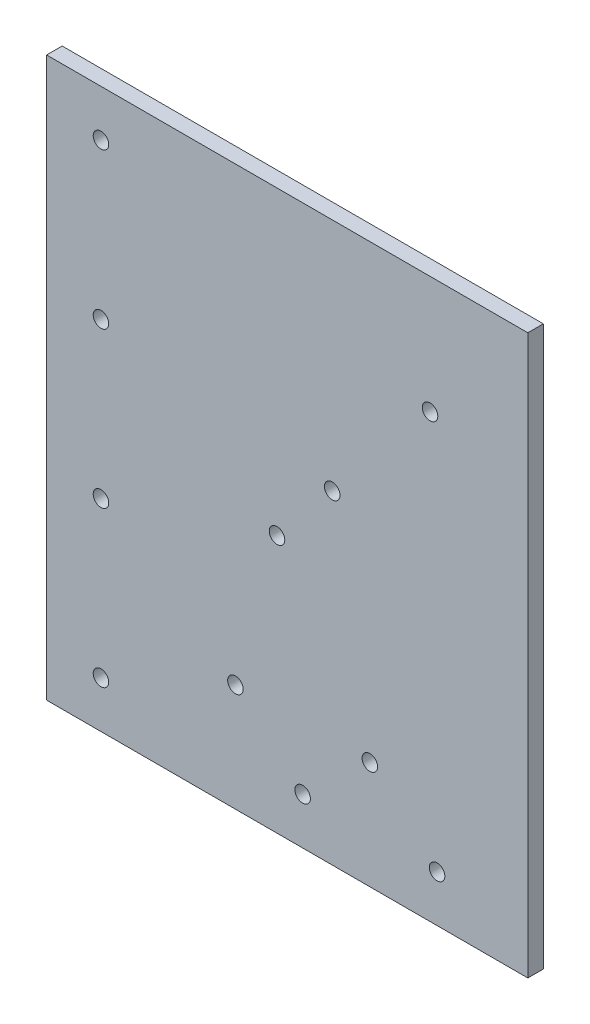
ISO-10303-21;
HEADER;
FILE_DESCRIPTION(('STEP AP214'),'2;1');
FILE_NAME('part.step','',(''),(''),'','','');
FILE_SCHEMA(('AUTOMOTIVE_DESIGN { 1 0 10303 214 1 1 1 1 }'));
ENDSEC;
DATA;
#1=APPLICATION_CONTEXT('core data for automotive mechanical design processes');
#2=APPLICATION_PROTOCOL_DEFINITION('international standard','automotive_design',2000,#1);
#3=PRODUCT_CONTEXT('',#1,'mechanical');
#4=PRODUCT('Part','Part','',(#3));
#5=PRODUCT_RELATED_PRODUCT_CATEGORY('part','',(#4));
#6=PRODUCT_DEFINITION_FORMATION('','',#4);
#7=PRODUCT_DEFINITION_CONTEXT('part definition',#1,'design');
#8=PRODUCT_DEFINITION('design','',#6,#7);
#9=PRODUCT_DEFINITION_SHAPE('','',#8);
#10=(LENGTH_UNIT() NAMED_UNIT(*) SI_UNIT(.MILLI.,.METRE.));
#11=(NAMED_UNIT(*) PLANE_ANGLE_UNIT() SI_UNIT($,.RADIAN.));
#12=(NAMED_UNIT(*) SI_UNIT($,.STERADIAN.) SOLID_ANGLE_UNIT());
#13=UNCERTAINTY_MEASURE_WITH_UNIT(LENGTH_MEASURE(1.E-05),#10,'distance_accuracy_value','');
#14=(GEOMETRIC_REPRESENTATION_CONTEXT(3) GLOBAL_UNCERTAINTY_ASSIGNED_CONTEXT((#13)) GLOBAL_UNIT_ASSIGNED_CONTEXT((#10,
#11,#12)) REPRESENTATION_CONTEXT('',''));
#15=CARTESIAN_POINT('',(0.,0.,0.));
#16=DIRECTION('',(0.,0.,1.));
#17=DIRECTION('',(1.,0.,0.));
#18=AXIS2_PLACEMENT_3D('',#15,#16,#17);
#19=CARTESIAN_POINT('',(0.,0.,12.7));
#20=DIRECTION('',(1.,0.,0.));
#21=DIRECTION('',(0.,0.,-1.));
#22=AXIS2_PLACEMENT_3D('',#19,#20,#21);
#23=PLANE('',#22);
#24=DIRECTION('',(0.,-1.,0.));
#25=VECTOR('',#24,1.);
#26=CARTESIAN_POINT('',(0.,0.,0.));
#27=LINE('',#26,#25);
#28=CARTESIAN_POINT('',(0.,457.2,0.));
#29=VERTEX_POINT('',#28);
#30=CARTESIAN_POINT('',(0.,0.,0.));
#31=VERTEX_POINT('',#30);
#32=EDGE_CURVE('E104',#29,#31,#27,.T.);
#33=ORIENTED_EDGE('',*,*,#32,.T.);
#34=DIRECTION('',(0.,0.,-1.));
#35=VECTOR('',#34,1.);
#36=CARTESIAN_POINT('',(0.,0.,12.7));
#37=LINE('',#36,#35);
#38=CARTESIAN_POINT('',(0.,0.,12.7));
#39=VERTEX_POINT('',#38);
#40=EDGE_CURVE('E95',#39,#31,#37,.T.);
#41=ORIENTED_EDGE('',*,*,#40,.F.);
#42=DIRECTION('',(0.,-1.,0.));
#43=VECTOR('',#42,1.);
#44=CARTESIAN_POINT('',(0.,0.,12.7));
#45=LINE('',#44,#43);
#46=CARTESIAN_POINT('',(0.,457.2,12.7));
#47=VERTEX_POINT('',#46);
#48=EDGE_CURVE('E89',#47,#39,#45,.T.);
#49=ORIENTED_EDGE('',*,*,#48,.F.);
#50=DIRECTION('',(0.,0.,-1.));
#51=VECTOR('',#50,1.);
#52=CARTESIAN_POINT('',(0.,457.2,12.7));
#53=LINE('',#52,#51);
#54=EDGE_CURVE('E100',#47,#29,#53,.T.);
#55=ORIENTED_EDGE('',*,*,#54,.T.);
#56=EDGE_LOOP('',(#33,#41,#49,#55));
#57=FACE_BOUND('',#56,.T.);
#58=ADVANCED_FACE('F34',(#57),#23,.F.);
#59=CARTESIAN_POINT('',(0.,0.,12.7));
#60=DIRECTION('',(0.,1.,0.));
#61=DIRECTION('',(0.,0.,1.));
#62=AXIS2_PLACEMENT_3D('',#59,#60,#61);
#63=PLANE('',#62);
#64=DIRECTION('',(1.,0.,0.));
#65=VECTOR('',#64,1.);
#66=CARTESIAN_POINT('',(0.,0.,0.));
#67=LINE('',#66,#65);
#68=CARTESIAN_POINT('',(393.7,0.,0.));
#69=VERTEX_POINT('',#68);
#70=EDGE_CURVE('E94',#31,#69,#67,.T.);
#71=ORIENTED_EDGE('',*,*,#70,.T.);
#72=DIRECTION('',(0.,0.,-1.));
#73=VECTOR('',#72,1.);
#74=CARTESIAN_POINT('',(393.7,0.,12.7));
#75=LINE('',#74,#73);
#76=CARTESIAN_POINT('',(393.7,0.,12.7));
#77=VERTEX_POINT('',#76);
#78=EDGE_CURVE('E92',#77,#69,#75,.T.);
#79=ORIENTED_EDGE('',*,*,#78,.F.);
#80=DIRECTION('',(1.,0.,0.));
#81=VECTOR('',#80,1.);
#82=CARTESIAN_POINT('',(0.,0.,12.7));
#83=LINE('',#82,#81);
#84=EDGE_CURVE('E83',#39,#77,#83,.T.);
#85=ORIENTED_EDGE('',*,*,#84,.F.);
#86=ORIENTED_EDGE('',*,*,#40,.T.);
#87=EDGE_LOOP('',(#71,#79,#85,#86));
#88=FACE_BOUND('',#87,.T.);
#89=ADVANCED_FACE('F93',(#88),#63,.F.);
#90=CARTESIAN_POINT('',(393.7,0.,12.7));
#91=DIRECTION('',(-1.,0.,0.));
#92=DIRECTION('',(0.,0.,1.));
#93=AXIS2_PLACEMENT_3D('',#90,#91,#92);
#94=PLANE('',#93);
#95=DIRECTION('',(0.,1.,0.));
#96=VECTOR('',#95,1.);
#97=CARTESIAN_POINT('',(393.7,0.,0.));
#98=LINE('',#97,#96);
#99=CARTESIAN_POINT('',(393.7,457.2,0.));
#100=VERTEX_POINT('',#99);
#101=EDGE_CURVE('E69',#69,#100,#98,.T.);
#102=ORIENTED_EDGE('',*,*,#101,.T.);
#103=DIRECTION('',(0.,0.,-1.));
#104=VECTOR('',#103,1.);
#105=CARTESIAN_POINT('',(393.7,457.2,12.7));
#106=LINE('',#105,#104);
#107=CARTESIAN_POINT('',(393.7,457.2,12.7));
#108=VERTEX_POINT('',#107);
#109=EDGE_CURVE('E96',#108,#100,#106,.T.);
#110=ORIENTED_EDGE('',*,*,#109,.F.);
#111=DIRECTION('',(0.,1.,0.));
#112=VECTOR('',#111,1.);
#113=CARTESIAN_POINT('',(393.7,0.,12.7));
#114=LINE('',#113,#112);
#115=EDGE_CURVE('E87',#77,#108,#114,.T.);
#116=ORIENTED_EDGE('',*,*,#115,.F.);
#117=ORIENTED_EDGE('',*,*,#78,.T.);
#118=EDGE_LOOP('',(#102,#110,#116,#117));
#119=FACE_BOUND('',#118,.T.);
#120=ADVANCED_FACE('F98',(#119),#94,.F.);
#121=CARTESIAN_POINT('',(0.,457.2,12.7));
#122=DIRECTION('',(0.,-1.,0.));
#123=DIRECTION('',(0.,0.,-1.));
#124=AXIS2_PLACEMENT_3D('',#121,#122,#123);
#125=PLANE('',#124);
#126=DIRECTION('',(-1.,0.,0.));
#127=VECTOR('',#126,1.);
#128=CARTESIAN_POINT('',(0.,457.2,0.));
#129=LINE('',#128,#127);
#130=EDGE_CURVE('E75',#100,#29,#129,.T.);
#131=ORIENTED_EDGE('',*,*,#130,.T.);
#132=ORIENTED_EDGE('',*,*,#54,.F.);
#133=DIRECTION('',(-1.,0.,0.));
#134=VECTOR('',#133,1.);
#135=CARTESIAN_POINT('',(0.,457.2,12.7));
#136=LINE('',#135,#134);
#137=EDGE_CURVE('E52',#108,#47,#136,.T.);
#138=ORIENTED_EDGE('',*,*,#137,.F.);
#139=ORIENTED_EDGE('',*,*,#109,.T.);
#140=EDGE_LOOP('',(#131,#132,#138,#139));
#141=FACE_BOUND('',#140,.T.);
#142=ADVANCED_FACE('F140',(#141),#125,.F.);
#143=CARTESIAN_POINT('',(0.,457.2,12.7));
#144=DIRECTION('',(0.,0.,-1.));
#145=DIRECTION('',(-1.,0.,0.));
#146=AXIS2_PLACEMENT_3D('',#143,#144,#145);
#147=PLANE('',#146);
#148=CARTESIAN_POINT('',(264.45,88.1,12.7));
#149=DIRECTION('',(0.,0.,1.));
#150=DIRECTION('',(1.,0.,0.));
#151=AXIS2_PLACEMENT_3D('',#148,#149,#150);
#152=CIRCLE('',#151,6.35000000000002);
#153=CARTESIAN_POINT('',(270.8,88.1,12.7));
#154=VERTEX_POINT('',#153);
#155=EDGE_CURVE('E208',#154,#154,#152,.T.);
#156=ORIENTED_EDGE('',*,*,#155,.F.);
#157=EDGE_LOOP('',(#156));
#158=FACE_BOUND('',#157,.T.);
#159=CARTESIAN_POINT('',(154.45,88.1,12.7));
#160=DIRECTION('',(0.,0.,1.));
#161=DIRECTION('',(1.,0.,0.));
#162=AXIS2_PLACEMENT_3D('',#159,#160,#161);
#163=CIRCLE('',#162,6.34999999999999);
#164=CARTESIAN_POINT('',(160.8,88.1,12.7));
#165=VERTEX_POINT('',#164);
#166=EDGE_CURVE('E210',#165,#165,#163,.T.);
#167=ORIENTED_EDGE('',*,*,#166,.F.);
#168=EDGE_LOOP('',(#167));
#169=FACE_BOUND('',#168,.T.);
#170=CARTESIAN_POINT('',(319.45,38.1,12.7));
#171=DIRECTION('',(0.,0.,1.));
#172=DIRECTION('',(1.,0.,0.));
#173=AXIS2_PLACEMENT_3D('',#170,#171,#172);
#174=CIRCLE('',#173,6.35000000000002);
#175=CARTESIAN_POINT('',(325.8,38.1,12.7));
#176=VERTEX_POINT('',#175);
#177=EDGE_CURVE('E218',#176,#176,#174,.T.);
#178=ORIENTED_EDGE('',*,*,#177,.F.);
#179=EDGE_LOOP('',(#178));
#180=FACE_BOUND('',#179,.T.);
#181=CARTESIAN_POINT('',(209.45,38.1,12.7));
#182=DIRECTION('',(0.,0.,1.));
#183=DIRECTION('',(1.,0.,0.));
#184=AXIS2_PLACEMENT_3D('',#181,#182,#183);
#185=CIRCLE('',#184,6.34999999999999);
#186=CARTESIAN_POINT('',(215.8,38.1,12.7));
#187=VERTEX_POINT('',#186);
#188=EDGE_CURVE('E221',#187,#187,#185,.T.);
#189=ORIENTED_EDGE('',*,*,#188,.F.);
#190=EDGE_LOOP('',(#189));
#191=FACE_BOUND('',#190,.T.);
#192=CARTESIAN_POINT('',(188.491489924508,210.94978790941,12.7));
#193=DIRECTION('',(0.,0.,1.));
#194=DIRECTION('',(1.,0.,0.));
#195=AXIS2_PLACEMENT_3D('',#192,#193,#194);
#196=CIRCLE('',#195,6.34999999999999);
#197=CARTESIAN_POINT('',(194.841489924508,210.94978790941,12.7));
#198=VERTEX_POINT('',#197);
#199=EDGE_CURVE('E227',#198,#198,#196,.T.);
#200=ORIENTED_EDGE('',*,*,#199,.F.);
#201=EDGE_LOOP('',(#200));
#202=FACE_BOUND('',#201,.T.);
#203=CARTESIAN_POINT('',(313.67695004194,361.172340050328,12.7));
#204=DIRECTION('',(0.,0.,1.));
#205=DIRECTION('',(1.,0.,0.));
#206=AXIS2_PLACEMENT_3D('',#203,#204,#205);
#207=CIRCLE('',#206,6.35000000000002);
#208=CARTESIAN_POINT('',(320.02695004194,361.172340050328,12.7));
#209=VERTEX_POINT('',#208);
#210=EDGE_CURVE('E233',#209,#209,#207,.T.);
#211=ORIENTED_EDGE('',*,*,#210,.F.);
#212=EDGE_LOOP('',(#211));
#213=FACE_BOUND('',#212,.T.);
#214=CARTESIAN_POINT('',(233.65390008388,265.144680100656,12.7));
#215=DIRECTION('',(0.,0.,1.));
#216=DIRECTION('',(1.,0.,0.));
#217=AXIS2_PLACEMENT_3D('',#214,#215,#216);
#218=CIRCLE('',#217,6.34999999999999);
#219=CARTESIAN_POINT('',(240.00390008388,265.144680100656,12.7));
#220=VERTEX_POINT('',#219);
#221=EDGE_CURVE('E239',#220,#220,#218,.T.);
#222=ORIENTED_EDGE('',*,*,#221,.F.);
#223=EDGE_LOOP('',(#222));
#224=FACE_BOUND('',#223,.T.);
#225=CARTESIAN_POINT('',(44.45,165.1,12.7));
#226=DIRECTION('',(0.,0.,1.));
#227=DIRECTION('',(1.,0.,0.));
#228=AXIS2_PLACEMENT_3D('',#225,#226,#227);
#229=CIRCLE('',#228,6.34999999999999);
#230=CARTESIAN_POINT('',(50.8,165.1,12.7));
#231=VERTEX_POINT('',#230);
#232=EDGE_CURVE('E247',#231,#231,#229,.T.);
#233=ORIENTED_EDGE('',*,*,#232,.F.);
#234=EDGE_LOOP('',(#233));
#235=FACE_BOUND('',#234,.T.);
#236=CARTESIAN_POINT('',(44.45,38.1,12.7));
#237=DIRECTION('',(0.,0.,1.));
#238=DIRECTION('',(1.,0.,0.));
#239=AXIS2_PLACEMENT_3D('',#236,#237,#238);
#240=CIRCLE('',#239,6.34999999999999);
#241=CARTESIAN_POINT('',(50.8,38.1,12.7));
#242=VERTEX_POINT('',#241);
#243=EDGE_CURVE('E117',#242,#242,#240,.T.);
#244=ORIENTED_EDGE('',*,*,#243,.F.);
#245=EDGE_LOOP('',(#244));
#246=FACE_BOUND('',#245,.T.);
#247=ORIENTED_EDGE('',*,*,#48,.T.);
#248=ORIENTED_EDGE('',*,*,#84,.T.);
#249=ORIENTED_EDGE('',*,*,#115,.T.);
#250=ORIENTED_EDGE('',*,*,#137,.T.);
#251=EDGE_LOOP('',(#247,#248,#249,#250));
#252=FACE_BOUND('',#251,.T.);
#253=CARTESIAN_POINT('',(44.45,292.1,12.7));
#254=DIRECTION('',(0.,0.,1.));
#255=DIRECTION('',(1.,0.,0.));
#256=AXIS2_PLACEMENT_3D('',#253,#254,#255);
#257=CIRCLE('',#256,6.34999999999999);
#258=CARTESIAN_POINT('',(50.8,292.1,12.7));
#259=VERTEX_POINT('',#258);
#260=EDGE_CURVE('E120',#259,#259,#257,.T.);
#261=ORIENTED_EDGE('',*,*,#260,.F.);
#262=EDGE_LOOP('',(#261));
#263=FACE_BOUND('',#262,.T.);
#264=CARTESIAN_POINT('',(44.45,419.1,12.7));
#265=DIRECTION('',(0.,0.,1.));
#266=DIRECTION('',(1.,0.,0.));
#267=AXIS2_PLACEMENT_3D('',#264,#265,#266);
#268=CIRCLE('',#267,6.34999999999999);
#269=CARTESIAN_POINT('',(50.8,419.1,12.7));
#270=VERTEX_POINT('',#269);
#271=EDGE_CURVE('E11',#270,#270,#268,.T.);
#272=ORIENTED_EDGE('',*,*,#271,.F.);
#273=EDGE_LOOP('',(#272));
#274=FACE_BOUND('',#273,.T.);
#275=ADVANCED_FACE('F84',(#158,#169,#180,#191,#202,#213,#224,#235,#246,#252,#263,#274),#147,.F.);
#276=CARTESIAN_POINT('',(0.,457.2,0.));
#277=DIRECTION('',(0.,0.,-1.));
#278=DIRECTION('',(-1.,0.,0.));
#279=AXIS2_PLACEMENT_3D('',#276,#277,#278);
#280=PLANE('',#279);
#281=CARTESIAN_POINT('',(264.45,88.1,0.));
#282=DIRECTION('',(0.,0.,-1.));
#283=DIRECTION('',(-1.,0.,0.));
#284=AXIS2_PLACEMENT_3D('',#281,#282,#283);
#285=CIRCLE('',#284,6.34999999999999);
#286=CARTESIAN_POINT('',(258.1,88.1,0.));
#287=VERTEX_POINT('',#286);
#288=EDGE_CURVE('E205',#287,#287,#285,.T.);
#289=ORIENTED_EDGE('',*,*,#288,.F.);
#290=EDGE_LOOP('',(#289));
#291=FACE_BOUND('',#290,.T.);
#292=CARTESIAN_POINT('',(154.45,88.1,0.));
#293=DIRECTION('',(0.,0.,-1.));
#294=DIRECTION('',(-1.,0.,0.));
#295=AXIS2_PLACEMENT_3D('',#292,#293,#294);
#296=CIRCLE('',#295,6.34999999999999);
#297=CARTESIAN_POINT('',(148.1,88.1,0.));
#298=VERTEX_POINT('',#297);
#299=EDGE_CURVE('E215',#298,#298,#296,.T.);
#300=ORIENTED_EDGE('',*,*,#299,.F.);
#301=EDGE_LOOP('',(#300));
#302=FACE_BOUND('',#301,.T.);
#303=CARTESIAN_POINT('',(319.45,38.1,0.));
#304=DIRECTION('',(0.,0.,-1.));
#305=DIRECTION('',(-1.,0.,0.));
#306=AXIS2_PLACEMENT_3D('',#303,#304,#305);
#307=CIRCLE('',#306,6.34999999999999);
#308=CARTESIAN_POINT('',(313.1,38.1,0.));
#309=VERTEX_POINT('',#308);
#310=EDGE_CURVE('E38',#309,#309,#307,.T.);
#311=ORIENTED_EDGE('',*,*,#310,.F.);
#312=EDGE_LOOP('',(#311));
#313=FACE_BOUND('',#312,.T.);
#314=CARTESIAN_POINT('',(209.45,38.1,0.));
#315=DIRECTION('',(0.,0.,-1.));
#316=DIRECTION('',(-1.,0.,0.));
#317=AXIS2_PLACEMENT_3D('',#314,#315,#316);
#318=CIRCLE('',#317,6.34999999999999);
#319=CARTESIAN_POINT('',(203.1,38.1,0.));
#320=VERTEX_POINT('',#319);
#321=EDGE_CURVE('E224',#320,#320,#318,.T.);
#322=ORIENTED_EDGE('',*,*,#321,.F.);
#323=EDGE_LOOP('',(#322));
#324=FACE_BOUND('',#323,.T.);
#325=CARTESIAN_POINT('',(188.491489924508,210.94978790941,0.));
#326=DIRECTION('',(0.,0.,-1.));
#327=DIRECTION('',(-1.,0.,0.));
#328=AXIS2_PLACEMENT_3D('',#325,#326,#327);
#329=CIRCLE('',#328,6.34999999999999);
#330=CARTESIAN_POINT('',(182.141489924508,210.94978790941,0.));
#331=VERTEX_POINT('',#330);
#332=EDGE_CURVE('E230',#331,#331,#329,.T.);
#333=ORIENTED_EDGE('',*,*,#332,.F.);
#334=EDGE_LOOP('',(#333));
#335=FACE_BOUND('',#334,.T.);
#336=CARTESIAN_POINT('',(313.67695004194,361.172340050328,0.));
#337=DIRECTION('',(0.,0.,-1.));
#338=DIRECTION('',(-1.,0.,0.));
#339=AXIS2_PLACEMENT_3D('',#336,#337,#338);
#340=CIRCLE('',#339,6.34999999999999);
#341=CARTESIAN_POINT('',(307.32695004194,361.172340050328,0.));
#342=VERTEX_POINT('',#341);
#343=EDGE_CURVE('E236',#342,#342,#340,.T.);
#344=ORIENTED_EDGE('',*,*,#343,.F.);
#345=EDGE_LOOP('',(#344));
#346=FACE_BOUND('',#345,.T.);
#347=CARTESIAN_POINT('',(233.65390008388,265.144680100656,0.));
#348=DIRECTION('',(0.,0.,-1.));
#349=DIRECTION('',(-1.,0.,0.));
#350=AXIS2_PLACEMENT_3D('',#347,#348,#349);
#351=CIRCLE('',#350,6.34999999999999);
#352=CARTESIAN_POINT('',(227.30390008388,265.144680100656,0.));
#353=VERTEX_POINT('',#352);
#354=EDGE_CURVE('E242',#353,#353,#351,.T.);
#355=ORIENTED_EDGE('',*,*,#354,.F.);
#356=EDGE_LOOP('',(#355));
#357=FACE_BOUND('',#356,.T.);
#358=CARTESIAN_POINT('',(44.45,165.1,0.));
#359=DIRECTION('',(0.,0.,-1.));
#360=DIRECTION('',(-1.,0.,0.));
#361=AXIS2_PLACEMENT_3D('',#358,#359,#360);
#362=CIRCLE('',#361,6.34999999999999);
#363=CARTESIAN_POINT('',(38.1,165.1,0.));
#364=VERTEX_POINT('',#363);
#365=EDGE_CURVE('E245',#364,#364,#362,.T.);
#366=ORIENTED_EDGE('',*,*,#365,.F.);
#367=EDGE_LOOP('',(#366));
#368=FACE_BOUND('',#367,.T.);
#369=CARTESIAN_POINT('',(44.45,38.1,0.));
#370=DIRECTION('',(0.,0.,-1.));
#371=DIRECTION('',(-1.,0.,0.));
#372=AXIS2_PLACEMENT_3D('',#369,#370,#371);
#373=CIRCLE('',#372,6.34999999999999);
#374=CARTESIAN_POINT('',(38.1,38.1,0.));
#375=VERTEX_POINT('',#374);
#376=EDGE_CURVE('E107',#375,#375,#373,.T.);
#377=ORIENTED_EDGE('',*,*,#376,.F.);
#378=EDGE_LOOP('',(#377));
#379=FACE_BOUND('',#378,.T.);
#380=ORIENTED_EDGE('',*,*,#32,.F.);
#381=ORIENTED_EDGE('',*,*,#130,.F.);
#382=ORIENTED_EDGE('',*,*,#101,.F.);
#383=ORIENTED_EDGE('',*,*,#70,.F.);
#384=EDGE_LOOP('',(#380,#381,#382,#383));
#385=FACE_BOUND('',#384,.T.);
#386=CARTESIAN_POINT('',(44.45,292.1,0.));
#387=DIRECTION('',(0.,0.,-1.));
#388=DIRECTION('',(-1.,0.,0.));
#389=AXIS2_PLACEMENT_3D('',#386,#387,#388);
#390=CIRCLE('',#389,6.34999999999999);
#391=CARTESIAN_POINT('',(38.1,292.1,0.));
#392=VERTEX_POINT('',#391);
#393=EDGE_CURVE('E114',#392,#392,#390,.T.);
#394=ORIENTED_EDGE('',*,*,#393,.F.);
#395=EDGE_LOOP('',(#394));
#396=FACE_BOUND('',#395,.T.);
#397=CARTESIAN_POINT('',(44.45,419.1,0.));
#398=DIRECTION('',(0.,0.,-1.));
#399=DIRECTION('',(-1.,0.,0.));
#400=AXIS2_PLACEMENT_3D('',#397,#398,#399);
#401=CIRCLE('',#400,6.34999999999999);
#402=CARTESIAN_POINT('',(38.1,419.1,0.));
#403=VERTEX_POINT('',#402);
#404=EDGE_CURVE('E44',#403,#403,#401,.T.);
#405=ORIENTED_EDGE('',*,*,#404,.F.);
#406=EDGE_LOOP('',(#405));
#407=FACE_BOUND('',#406,.T.);
#408=ADVANCED_FACE('F128',(#291,#302,#313,#324,#335,#346,#357,#368,#379,#385,#396,#407),#280,.T.);
#409=CARTESIAN_POINT('',(44.45,38.1,12.7));
#410=DIRECTION('',(0.,0.,1.));
#411=DIRECTION('',(1.,0.,0.));
#412=AXIS2_PLACEMENT_3D('',#409,#410,#411);
#413=CYLINDRICAL_SURFACE('',#412,6.34999999999999);
#414=ORIENTED_EDGE('',*,*,#376,.T.);
#415=EDGE_LOOP('',(#414));
#416=FACE_BOUND('',#415,.T.);
#417=ORIENTED_EDGE('',*,*,#243,.T.);
#418=EDGE_LOOP('',(#417));
#419=FACE_BOUND('',#418,.T.);
#420=ADVANCED_FACE('F130',(#416,#419),#413,.F.);
#421=CARTESIAN_POINT('',(44.45,165.1,12.7));
#422=DIRECTION('',(0.,0.,1.));
#423=DIRECTION('',(1.,0.,0.));
#424=AXIS2_PLACEMENT_3D('',#421,#422,#423);
#425=CYLINDRICAL_SURFACE('',#424,6.34999999999999);
#426=ORIENTED_EDGE('',*,*,#365,.T.);
#427=EDGE_LOOP('',(#426));
#428=FACE_BOUND('',#427,.T.);
#429=ORIENTED_EDGE('',*,*,#232,.T.);
#430=EDGE_LOOP('',(#429));
#431=FACE_BOUND('',#430,.T.);
#432=ADVANCED_FACE('F137',(#428,#431),#425,.F.);
#433=CARTESIAN_POINT('',(44.45,292.1,12.7));
#434=DIRECTION('',(0.,0.,1.));
#435=DIRECTION('',(1.,0.,0.));
#436=AXIS2_PLACEMENT_3D('',#433,#434,#435);
#437=CYLINDRICAL_SURFACE('',#436,6.34999999999999);
#438=ORIENTED_EDGE('',*,*,#393,.T.);
#439=EDGE_LOOP('',(#438));
#440=FACE_BOUND('',#439,.T.);
#441=ORIENTED_EDGE('',*,*,#260,.T.);
#442=EDGE_LOOP('',(#441));
#443=FACE_BOUND('',#442,.T.);
#444=ADVANCED_FACE('F154',(#440,#443),#437,.F.);
#445=CARTESIAN_POINT('',(44.45,419.1,12.7));
#446=DIRECTION('',(0.,0.,1.));
#447=DIRECTION('',(1.,0.,0.));
#448=AXIS2_PLACEMENT_3D('',#445,#446,#447);
#449=CYLINDRICAL_SURFACE('',#448,6.34999999999999);
#450=ORIENTED_EDGE('',*,*,#404,.T.);
#451=EDGE_LOOP('',(#450));
#452=FACE_BOUND('',#451,.T.);
#453=ORIENTED_EDGE('',*,*,#271,.T.);
#454=EDGE_LOOP('',(#453));
#455=FACE_BOUND('',#454,.T.);
#456=ADVANCED_FACE('F36',(#452,#455),#449,.F.);
#457=CARTESIAN_POINT('',(233.65390008388,265.144680100656,12.7));
#458=DIRECTION('',(0.,0.,1.));
#459=DIRECTION('',(1.,0.,0.));
#460=AXIS2_PLACEMENT_3D('',#457,#458,#459);
#461=CYLINDRICAL_SURFACE('',#460,6.34999999999999);
#462=ORIENTED_EDGE('',*,*,#354,.T.);
#463=EDGE_LOOP('',(#462));
#464=FACE_BOUND('',#463,.T.);
#465=ORIENTED_EDGE('',*,*,#221,.T.);
#466=EDGE_LOOP('',(#465));
#467=FACE_BOUND('',#466,.T.);
#468=ADVANCED_FACE('F161',(#464,#467),#461,.F.);
#469=CARTESIAN_POINT('',(313.67695004194,361.172340050328,12.7));
#470=DIRECTION('',(0.,0.,1.));
#471=DIRECTION('',(1.,0.,0.));
#472=AXIS2_PLACEMENT_3D('',#469,#470,#471);
#473=CYLINDRICAL_SURFACE('',#472,6.34999999999999);
#474=ORIENTED_EDGE('',*,*,#343,.T.);
#475=EDGE_LOOP('',(#474));
#476=FACE_BOUND('',#475,.T.);
#477=ORIENTED_EDGE('',*,*,#210,.T.);
#478=EDGE_LOOP('',(#477));
#479=FACE_BOUND('',#478,.T.);
#480=ADVANCED_FACE('F177',(#476,#479),#473,.F.);
#481=CARTESIAN_POINT('',(188.491489924508,210.94978790941,12.7));
#482=DIRECTION('',(0.,0.,1.));
#483=DIRECTION('',(1.,0.,0.));
#484=AXIS2_PLACEMENT_3D('',#481,#482,#483);
#485=CYLINDRICAL_SURFACE('',#484,6.34999999999999);
#486=ORIENTED_EDGE('',*,*,#332,.T.);
#487=EDGE_LOOP('',(#486));
#488=FACE_BOUND('',#487,.T.);
#489=ORIENTED_EDGE('',*,*,#199,.T.);
#490=EDGE_LOOP('',(#489));
#491=FACE_BOUND('',#490,.T.);
#492=ADVANCED_FACE('F181',(#488,#491),#485,.F.);
#493=CARTESIAN_POINT('',(209.45,38.1,12.7));
#494=DIRECTION('',(0.,0.,1.));
#495=DIRECTION('',(1.,0.,0.));
#496=AXIS2_PLACEMENT_3D('',#493,#494,#495);
#497=CYLINDRICAL_SURFACE('',#496,6.34999999999999);
#498=ORIENTED_EDGE('',*,*,#321,.T.);
#499=EDGE_LOOP('',(#498));
#500=FACE_BOUND('',#499,.T.);
#501=ORIENTED_EDGE('',*,*,#188,.T.);
#502=EDGE_LOOP('',(#501));
#503=FACE_BOUND('',#502,.T.);
#504=ADVANCED_FACE('F185',(#500,#503),#497,.F.);
#505=CARTESIAN_POINT('',(319.45,38.1,12.7));
#506=DIRECTION('',(0.,0.,1.));
#507=DIRECTION('',(1.,0.,0.));
#508=AXIS2_PLACEMENT_3D('',#505,#506,#507);
#509=CYLINDRICAL_SURFACE('',#508,6.34999999999999);
#510=ORIENTED_EDGE('',*,*,#310,.T.);
#511=EDGE_LOOP('',(#510));
#512=FACE_BOUND('',#511,.T.);
#513=ORIENTED_EDGE('',*,*,#177,.T.);
#514=EDGE_LOOP('',(#513));
#515=FACE_BOUND('',#514,.T.);
#516=ADVANCED_FACE('F189',(#512,#515),#509,.F.);
#517=CARTESIAN_POINT('',(154.45,88.1,12.7));
#518=DIRECTION('',(0.,0.,1.));
#519=DIRECTION('',(1.,0.,0.));
#520=AXIS2_PLACEMENT_3D('',#517,#518,#519);
#521=CYLINDRICAL_SURFACE('',#520,6.34999999999999);
#522=ORIENTED_EDGE('',*,*,#299,.T.);
#523=EDGE_LOOP('',(#522));
#524=FACE_BOUND('',#523,.T.);
#525=ORIENTED_EDGE('',*,*,#166,.T.);
#526=EDGE_LOOP('',(#525));
#527=FACE_BOUND('',#526,.T.);
#528=ADVANCED_FACE('F193',(#524,#527),#521,.F.);
#529=CARTESIAN_POINT('',(264.45,88.1,12.7));
#530=DIRECTION('',(0.,0.,1.));
#531=DIRECTION('',(1.,0.,0.));
#532=AXIS2_PLACEMENT_3D('',#529,#530,#531);
#533=CYLINDRICAL_SURFACE('',#532,6.34999999999999);
#534=ORIENTED_EDGE('',*,*,#288,.T.);
#535=EDGE_LOOP('',(#534));
#536=FACE_BOUND('',#535,.T.);
#537=ORIENTED_EDGE('',*,*,#155,.T.);
#538=EDGE_LOOP('',(#537));
#539=FACE_BOUND('',#538,.T.);
#540=ADVANCED_FACE('F197',(#536,#539),#533,.F.);
#541=CLOSED_SHELL('',(#58,#89,#120,#142,#275,#408,#420,#432,#444,#456,#468,#480,#492,#504,#516,
#528,#540));
#542=MANIFOLD_SOLID_BREP('B2',#541);
#543=ADVANCED_BREP_SHAPE_REPRESENTATION('',(#18,#542),#14);
#544=SHAPE_DEFINITION_REPRESENTATION(#9,#543);
ENDSEC;
END-ISO-10303-21;
